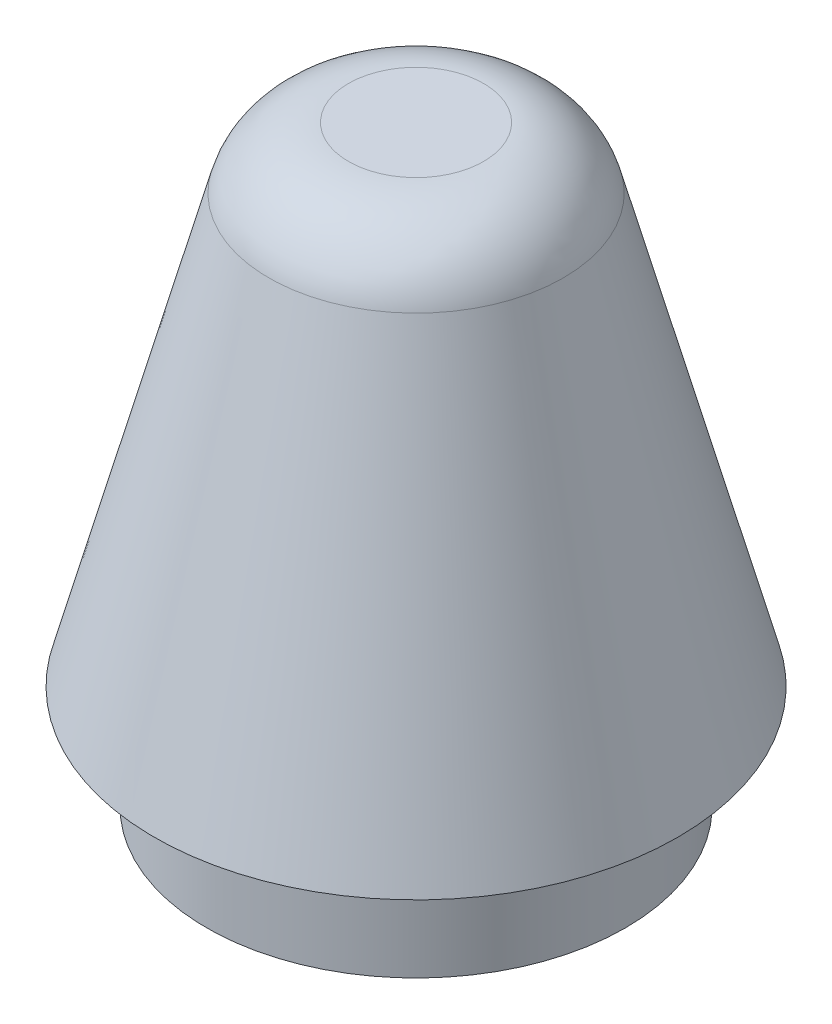
ISO-10303-21;
HEADER;
FILE_DESCRIPTION(('STEP AP214'),'2;1');
FILE_NAME('part.step','',(''),(''),'','','');
FILE_SCHEMA(('AUTOMOTIVE_DESIGN { 1 0 10303 214 1 1 1 1 }'));
ENDSEC;
DATA;
#1=APPLICATION_CONTEXT('core data for automotive mechanical design processes');
#2=APPLICATION_PROTOCOL_DEFINITION('international standard','automotive_design',2000,#1);
#3=PRODUCT_CONTEXT('',#1,'mechanical');
#4=PRODUCT('Part','Part','',(#3));
#5=PRODUCT_RELATED_PRODUCT_CATEGORY('part','',(#4));
#6=PRODUCT_DEFINITION_FORMATION('','',#4);
#7=PRODUCT_DEFINITION_CONTEXT('part definition',#1,'design');
#8=PRODUCT_DEFINITION('design','',#6,#7);
#9=PRODUCT_DEFINITION_SHAPE('','',#8);
#10=(LENGTH_UNIT() NAMED_UNIT(*) SI_UNIT(.MILLI.,.METRE.));
#11=(NAMED_UNIT(*) PLANE_ANGLE_UNIT() SI_UNIT($,.RADIAN.));
#12=(NAMED_UNIT(*) SI_UNIT($,.STERADIAN.) SOLID_ANGLE_UNIT());
#13=UNCERTAINTY_MEASURE_WITH_UNIT(LENGTH_MEASURE(1.E-05),#10,'distance_accuracy_value','');
#14=(GEOMETRIC_REPRESENTATION_CONTEXT(3) GLOBAL_UNCERTAINTY_ASSIGNED_CONTEXT((#13)) GLOBAL_UNIT_ASSIGNED_CONTEXT((#10,
#11,#12)) REPRESENTATION_CONTEXT('',''));
#15=CARTESIAN_POINT('',(0.,0.,0.));
#16=DIRECTION('',(0.,0.,1.));
#17=DIRECTION('',(1.,0.,0.));
#18=AXIS2_PLACEMENT_3D('',#15,#16,#17);
#19=CARTESIAN_POINT('',(12.7,-6.35,0.));
#20=DIRECTION('',(0.,-1.,0.));
#21=DIRECTION('',(1.,0.,0.));
#22=AXIS2_PLACEMENT_3D('',#19,#20,#21);
#23=PLANE('',#22);
#24=CARTESIAN_POINT('',(0.,-6.35,0.));
#25=DIRECTION('',(0.,-1.,0.));
#26=DIRECTION('',(1.,0.,0.));
#27=AXIS2_PLACEMENT_3D('',#24,#25,#26);
#28=CIRCLE('',#27,12.7);
#29=CARTESIAN_POINT('',(12.7,-6.35,0.));
#30=VERTEX_POINT('',#29);
#31=EDGE_CURVE('E57',#30,#30,#28,.T.);
#32=ORIENTED_EDGE('',*,*,#31,.T.);
#33=EDGE_LOOP('',(#32));
#34=FACE_BOUND('',#33,.T.);
#35=ADVANCED_FACE('F37',(#34),#23,.T.);
#36=CARTESIAN_POINT('',(0.,29.6231532850787,0.));
#37=DIRECTION('',(0.,1.,0.));
#38=DIRECTION('',(-1.,0.,0.));
#39=AXIS2_PLACEMENT_3D('',#36,#37,#38);
#40=PLANE('',#39);
#41=CARTESIAN_POINT('',(0.,29.6231532850787,0.));
#42=DIRECTION('',(0.,1.,0.));
#43=DIRECTION('',(-1.,0.,0.));
#44=AXIS2_PLACEMENT_3D('',#41,#42,#43);
#45=CIRCLE('',#44,4.10086506010517);
#46=CARTESIAN_POINT('',(-4.10086506010518,29.6231532850787,0.));
#47=VERTEX_POINT('',#46);
#48=EDGE_CURVE('E10',#47,#47,#45,.T.);
#49=ORIENTED_EDGE('',*,*,#48,.T.);
#50=EDGE_LOOP('',(#49));
#51=FACE_BOUND('',#50,.T.);
#52=ADVANCED_FACE('F77',(#51),#40,.T.);
#53=CARTESIAN_POINT('',(0.,0.,0.));
#54=DIRECTION('',(0.,-1.,0.));
#55=DIRECTION('',(1.,0.,0.));
#56=AXIS2_PLACEMENT_3D('',#53,#54,#55);
#57=CONICAL_SURFACE('',#56,15.875,0.261799387799143);
#58=CARTESIAN_POINT('',(0.,25.9172485105913,0.));
#59=DIRECTION('',(0.,1.,0.));
#60=DIRECTION('',(-1.,0.,0.));
#61=AXIS2_PLACEMENT_3D('',#58,#59,#60);
#62=CIRCLE('',#61,8.93049419155052);
#63=CARTESIAN_POINT('',(-8.93049419155053,25.9172485105913,0.));
#64=VERTEX_POINT('',#63);
#65=EDGE_CURVE('E44',#64,#64,#62,.F.);
#66=ORIENTED_EDGE('',*,*,#65,.T.);
#67=EDGE_LOOP('',(#66));
#68=FACE_BOUND('',#67,.T.);
#69=CARTESIAN_POINT('',(0.,0.,0.));
#70=DIRECTION('',(0.,-1.,0.));
#71=DIRECTION('',(1.,0.,0.));
#72=AXIS2_PLACEMENT_3D('',#69,#70,#71);
#73=CIRCLE('',#72,15.875);
#74=CARTESIAN_POINT('',(15.875,0.,0.));
#75=VERTEX_POINT('',#74);
#76=EDGE_CURVE('E48',#75,#75,#73,.T.);
#77=ORIENTED_EDGE('',*,*,#76,.F.);
#78=EDGE_LOOP('',(#77));
#79=FACE_BOUND('',#78,.T.);
#80=ADVANCED_FACE('F73',(#68,#79),#57,.T.);
#81=CARTESIAN_POINT('',(15.875,0.,0.));
#82=DIRECTION('',(0.,-1.,0.));
#83=DIRECTION('',(1.,0.,0.));
#84=AXIS2_PLACEMENT_3D('',#81,#82,#83);
#85=PLANE('',#84);
#86=ORIENTED_EDGE('',*,*,#76,.T.);
#87=EDGE_LOOP('',(#86));
#88=FACE_BOUND('',#87,.T.);
#89=CARTESIAN_POINT('',(0.,0.,0.));
#90=DIRECTION('',(0.,-1.,0.));
#91=DIRECTION('',(1.,0.,0.));
#92=AXIS2_PLACEMENT_3D('',#89,#90,#91);
#93=CIRCLE('',#92,12.7);
#94=CARTESIAN_POINT('',(12.7,0.,0.));
#95=VERTEX_POINT('',#94);
#96=EDGE_CURVE('E52',#95,#95,#93,.T.);
#97=ORIENTED_EDGE('',*,*,#96,.F.);
#98=EDGE_LOOP('',(#97));
#99=FACE_BOUND('',#98,.T.);
#100=ADVANCED_FACE('F64',(#88,#99),#85,.T.);
#101=CARTESIAN_POINT('',(0.,0.,0.));
#102=DIRECTION('',(0.,-1.,0.));
#103=DIRECTION('',(1.,0.,0.));
#104=AXIS2_PLACEMENT_3D('',#101,#102,#103);
#105=CYLINDRICAL_SURFACE('',#104,12.7);
#106=ORIENTED_EDGE('',*,*,#96,.T.);
#107=EDGE_LOOP('',(#106));
#108=FACE_BOUND('',#107,.T.);
#109=ORIENTED_EDGE('',*,*,#31,.F.);
#110=EDGE_LOOP('',(#109));
#111=FACE_BOUND('',#110,.T.);
#112=ADVANCED_FACE('F62',(#108,#111),#105,.T.);
#113=CARTESIAN_POINT('',(0.,24.6231532850787,0.));
#114=DIRECTION('',(0.,1.,0.));
#115=DIRECTION('',(-1.,0.,0.));
#116=AXIS2_PLACEMENT_3D('',#113,#114,#115);
#117=DEGENERATE_TOROIDAL_SURFACE('',#116,4.10086506010517,5.,.T.);
#118=ORIENTED_EDGE('',*,*,#48,.F.);
#119=EDGE_LOOP('',(#118));
#120=FACE_BOUND('',#119,.T.);
#121=ORIENTED_EDGE('',*,*,#65,.F.);
#122=EDGE_LOOP('',(#121));
#123=FACE_BOUND('',#122,.T.);
#124=ADVANCED_FACE('F39',(#120,#123),#117,.T.);
#125=CLOSED_SHELL('',(#35,#52,#80,#100,#112,#124));
#126=MANIFOLD_SOLID_BREP('B2',#125);
#127=ADVANCED_BREP_SHAPE_REPRESENTATION('',(#18,#126),#14);
#128=SHAPE_DEFINITION_REPRESENTATION(#9,#127);
ENDSEC;
END-ISO-10303-21;
